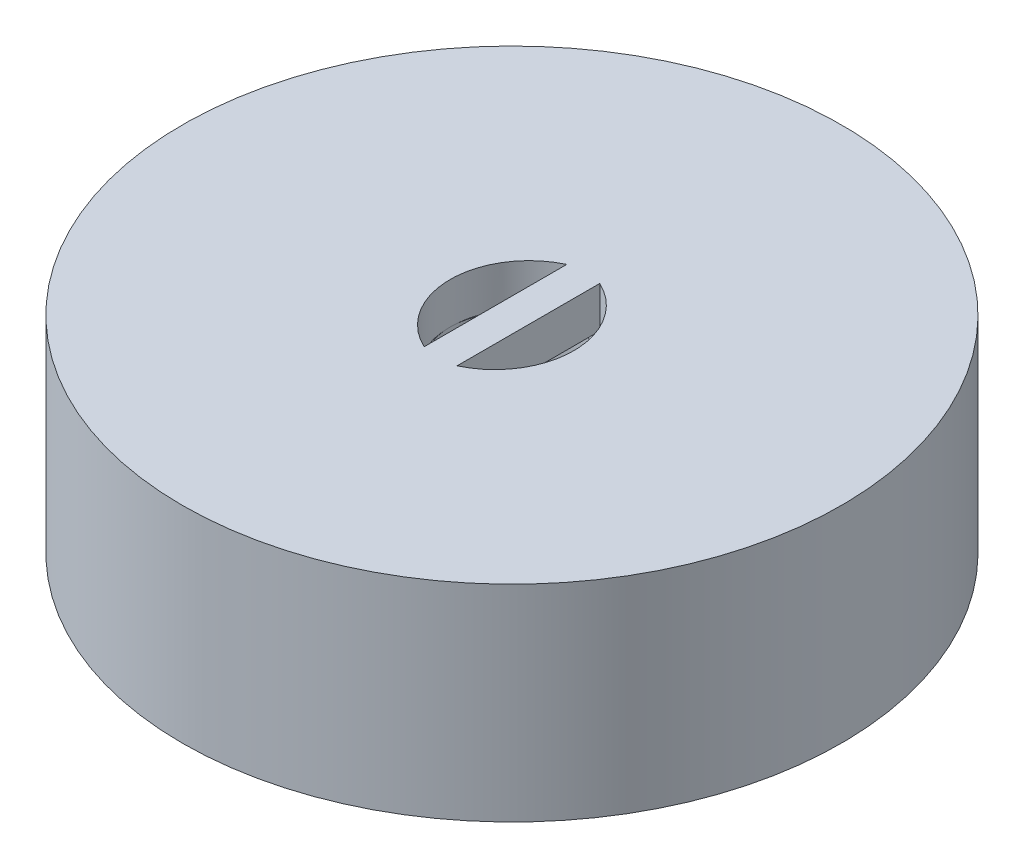
ISO-10303-21;
HEADER;
FILE_DESCRIPTION(('STEP AP214'),'2;1');
FILE_NAME('part.step','',(''),(''),'','','');
FILE_SCHEMA(('AUTOMOTIVE_DESIGN { 1 0 10303 214 1 1 1 1 }'));
ENDSEC;
DATA;
#1=APPLICATION_CONTEXT('core data for automotive mechanical design processes');
#2=APPLICATION_PROTOCOL_DEFINITION('international standard','automotive_design',2000,#1);
#3=PRODUCT_CONTEXT('',#1,'mechanical');
#4=PRODUCT('Part','Part','',(#3));
#5=PRODUCT_RELATED_PRODUCT_CATEGORY('part','',(#4));
#6=PRODUCT_DEFINITION_FORMATION('','',#4);
#7=PRODUCT_DEFINITION_CONTEXT('part definition',#1,'design');
#8=PRODUCT_DEFINITION('design','',#6,#7);
#9=PRODUCT_DEFINITION_SHAPE('','',#8);
#10=(LENGTH_UNIT() NAMED_UNIT(*) SI_UNIT(.MILLI.,.METRE.));
#11=(NAMED_UNIT(*) PLANE_ANGLE_UNIT() SI_UNIT($,.RADIAN.));
#12=(NAMED_UNIT(*) SI_UNIT($,.STERADIAN.) SOLID_ANGLE_UNIT());
#13=UNCERTAINTY_MEASURE_WITH_UNIT(LENGTH_MEASURE(1.E-05),#10,'distance_accuracy_value','');
#14=(GEOMETRIC_REPRESENTATION_CONTEXT(3) GLOBAL_UNCERTAINTY_ASSIGNED_CONTEXT((#13)) GLOBAL_UNIT_ASSIGNED_CONTEXT((#10,
#11,#12)) REPRESENTATION_CONTEXT('',''));
#15=CARTESIAN_POINT('',(0.,0.,0.));
#16=DIRECTION('',(0.,0.,1.));
#17=DIRECTION('',(1.,0.,0.));
#18=AXIS2_PLACEMENT_3D('',#15,#16,#17);
#19=CARTESIAN_POINT('',(-0.0516424017368183,0.5,0.));
#20=DIRECTION('',(0.,-1.,0.));
#21=DIRECTION('',(0.,0.,-1.));
#22=AXIS2_PLACEMENT_3D('',#19,#20,#21);
#23=PLANE('',#22);
#24=DIRECTION('',(0.,0.,1.));
#25=VECTOR('',#24,1.);
#26=CARTESIAN_POINT('',(0.05,0.5,-0.216466880786935));
#27=LINE('',#26,#25);
#28=CARTESIAN_POINT('',(0.05,0.5,-0.216466880786935));
#29=VERTEX_POINT('',#28);
#30=CARTESIAN_POINT('',(0.05,0.5,-0.180710403685012));
#31=VERTEX_POINT('',#30);
#32=EDGE_CURVE('E116',#29,#31,#27,.T.);
#33=ORIENTED_EDGE('',*,*,#32,.T.);
#34=CARTESIAN_POINT('',(0.,0.5,0.));
#35=DIRECTION('',(0.,-1.,0.));
#36=DIRECTION('',(0.,0.,-1.));
#37=AXIS2_PLACEMENT_3D('',#34,#35,#36);
#38=CIRCLE('',#37,0.1875);
#39=CARTESIAN_POINT('',(0.1875,0.5,0.));
#40=VERTEX_POINT('',#39);
#41=EDGE_CURVE('E102',#31,#40,#38,.T.);
#42=ORIENTED_EDGE('',*,*,#41,.T.);
#43=CARTESIAN_POINT('',(-0.0516424017368183,0.5,0.));
#44=DIRECTION('',(0.,1.,0.));
#45=DIRECTION('',(0.,0.,-1.));
#46=AXIS2_PLACEMENT_3D('',#43,#44,#45);
#47=CIRCLE('',#46,0.239142401736818);
#48=EDGE_CURVE('E121',#40,#29,#47,.T.);
#49=ORIENTED_EDGE('',*,*,#48,.T.);
#50=EDGE_LOOP('',(#33,#42,#49));
#51=FACE_BOUND('',#50,.T.);
#52=ADVANCED_FACE('F36',(#51),#23,.F.);
#53=CARTESIAN_POINT('',(0.0516424017368184,0.5,0.));
#54=DIRECTION('',(0.,1.,0.));
#55=DIRECTION('',(0.,0.,1.));
#56=AXIS2_PLACEMENT_3D('',#53,#54,#55);
#57=PLANE('',#56);
#58=DIRECTION('',(0.,0.,-1.));
#59=VECTOR('',#58,1.);
#60=CARTESIAN_POINT('',(-0.05,0.5,-0.216466880786935));
#61=LINE('',#60,#59);
#62=CARTESIAN_POINT('',(-0.05,0.5,0.216466880786935));
#63=VERTEX_POINT('',#62);
#64=CARTESIAN_POINT('',(-0.05,0.5,0.180710403685012));
#65=VERTEX_POINT('',#64);
#66=EDGE_CURVE('E317',#63,#65,#61,.T.);
#67=ORIENTED_EDGE('',*,*,#66,.T.);
#68=CARTESIAN_POINT('',(-0.1875,0.5,0.));
#69=VERTEX_POINT('',#68);
#70=EDGE_CURVE('E335',#65,#69,#38,.T.);
#71=ORIENTED_EDGE('',*,*,#70,.T.);
#72=CARTESIAN_POINT('',(0.0516424017368184,0.5,0.));
#73=DIRECTION('',(0.,1.,0.));
#74=DIRECTION('',(0.,0.,1.));
#75=AXIS2_PLACEMENT_3D('',#72,#73,#74);
#76=CIRCLE('',#75,0.239142401736818);
#77=EDGE_CURVE('E316',#69,#63,#76,.T.);
#78=ORIENTED_EDGE('',*,*,#77,.T.);
#79=EDGE_LOOP('',(#67,#71,#78));
#80=FACE_BOUND('',#79,.T.);
#81=ADVANCED_FACE('F156',(#80),#57,.T.);
#82=CARTESIAN_POINT('',(0.,0.625,0.));
#83=DIRECTION('',(0.,-1.,0.));
#84=DIRECTION('',(0.,0.,-1.));
#85=AXIS2_PLACEMENT_3D('',#82,#83,#84);
#86=CYLINDRICAL_SURFACE('',#85,1.);
#87=CARTESIAN_POINT('',(0.,0.625,0.));
#88=DIRECTION('',(0.,1.,0.));
#89=DIRECTION('',(0.,0.,1.));
#90=AXIS2_PLACEMENT_3D('',#87,#88,#89);
#91=CIRCLE('',#90,1.);
#92=CARTESIAN_POINT('',(0.,0.625,1.));
#93=VERTEX_POINT('',#92);
#94=EDGE_CURVE('E136',#93,#93,#91,.T.);
#95=ORIENTED_EDGE('',*,*,#94,.F.);
#96=EDGE_LOOP('',(#95));
#97=FACE_BOUND('',#96,.T.);
#98=CARTESIAN_POINT('',(0.,0.,0.));
#99=DIRECTION('',(0.,1.,0.));
#100=DIRECTION('',(0.,0.,1.));
#101=AXIS2_PLACEMENT_3D('',#98,#99,#100);
#102=CIRCLE('',#101,1.);
#103=CARTESIAN_POINT('',(0.,0.,1.));
#104=VERTEX_POINT('',#103);
#105=EDGE_CURVE('E139',#104,#104,#102,.T.);
#106=ORIENTED_EDGE('',*,*,#105,.T.);
#107=EDGE_LOOP('',(#106));
#108=FACE_BOUND('',#107,.T.);
#109=ADVANCED_FACE('F162',(#97,#108),#86,.T.);
#110=CARTESIAN_POINT('',(0.,0.625,0.));
#111=DIRECTION('',(0.,1.,0.));
#112=DIRECTION('',(0.,0.,1.));
#113=AXIS2_PLACEMENT_3D('',#110,#111,#112);
#114=PLANE('',#113);
#115=CARTESIAN_POINT('',(0.0516424017368184,0.625,0.));
#116=DIRECTION('',(0.,1.,0.));
#117=DIRECTION('',(0.,0.,1.));
#118=AXIS2_PLACEMENT_3D('',#115,#116,#117);
#119=CIRCLE('',#118,0.239142401736818);
#120=CARTESIAN_POINT('',(-0.05,0.625,-0.216466880786935));
#121=VERTEX_POINT('',#120);
#122=CARTESIAN_POINT('',(-0.05,0.625,0.216466880786935));
#123=VERTEX_POINT('',#122);
#124=EDGE_CURVE('E134',#121,#123,#119,.T.);
#125=ORIENTED_EDGE('',*,*,#124,.F.);
#126=DIRECTION('',(0.,0.,-1.));
#127=VECTOR('',#126,1.);
#128=CARTESIAN_POINT('',(-0.05,0.625,-0.216466880786935));
#129=LINE('',#128,#127);
#130=EDGE_CURVE('E322',#123,#121,#129,.T.);
#131=ORIENTED_EDGE('',*,*,#130,.F.);
#132=EDGE_LOOP('',(#125,#131));
#133=FACE_BOUND('',#132,.T.);
#134=CARTESIAN_POINT('',(-0.0516424017368183,0.625,0.));
#135=DIRECTION('',(0.,1.,0.));
#136=DIRECTION('',(0.,0.,-1.));
#137=AXIS2_PLACEMENT_3D('',#134,#135,#136);
#138=CIRCLE('',#137,0.239142401736818);
#139=CARTESIAN_POINT('',(0.05,0.625,0.216466880786935));
#140=VERTEX_POINT('',#139);
#141=CARTESIAN_POINT('',(0.05,0.625,-0.216466880786935));
#142=VERTEX_POINT('',#141);
#143=EDGE_CURVE('E130',#140,#142,#138,.T.);
#144=ORIENTED_EDGE('',*,*,#143,.F.);
#145=DIRECTION('',(0.,0.,1.));
#146=VECTOR('',#145,1.);
#147=CARTESIAN_POINT('',(0.05,0.625,-0.216466880786935));
#148=LINE('',#147,#146);
#149=EDGE_CURVE('E132',#142,#140,#148,.T.);
#150=ORIENTED_EDGE('',*,*,#149,.F.);
#151=EDGE_LOOP('',(#144,#150));
#152=FACE_BOUND('',#151,.T.);
#153=ORIENTED_EDGE('',*,*,#94,.T.);
#154=EDGE_LOOP('',(#153));
#155=FACE_BOUND('',#154,.T.);
#156=ADVANCED_FACE('F184',(#133,#152,#155),#114,.T.);
#157=CARTESIAN_POINT('',(0.,0.,0.));
#158=DIRECTION('',(0.,1.,0.));
#159=DIRECTION('',(0.,0.,1.));
#160=AXIS2_PLACEMENT_3D('',#157,#158,#159);
#161=PLANE('',#160);
#162=CARTESIAN_POINT('',(0.,0.,0.));
#163=DIRECTION('',(0.,1.,0.));
#164=DIRECTION('',(0.,0.,1.));
#165=AXIS2_PLACEMENT_3D('',#162,#163,#164);
#166=CIRCLE('',#165,0.475);
#167=CARTESIAN_POINT('',(0.,0.,0.475));
#168=VERTEX_POINT('',#167);
#169=EDGE_CURVE('E11',#168,#168,#166,.T.);
#170=ORIENTED_EDGE('',*,*,#169,.T.);
#171=EDGE_LOOP('',(#170));
#172=FACE_BOUND('',#171,.T.);
#173=ORIENTED_EDGE('',*,*,#105,.F.);
#174=EDGE_LOOP('',(#173));
#175=FACE_BOUND('',#174,.T.);
#176=ADVANCED_FACE('F187',(#172,#175),#161,.F.);
#177=CARTESIAN_POINT('',(-0.0516424017368183,0.5,0.));
#178=DIRECTION('',(0.,1.,0.));
#179=DIRECTION('',(0.,0.,1.));
#180=AXIS2_PLACEMENT_3D('',#177,#178,#179);
#181=CYLINDRICAL_SURFACE('',#180,0.239142401736818);
#182=ORIENTED_EDGE('',*,*,#143,.T.);
#183=DIRECTION('',(0.,1.,0.));
#184=VECTOR('',#183,1.);
#185=CARTESIAN_POINT('',(0.05,0.5,-0.216466880786935));
#186=LINE('',#185,#184);
#187=EDGE_CURVE('E123',#29,#142,#186,.T.);
#188=ORIENTED_EDGE('',*,*,#187,.F.);
#189=ORIENTED_EDGE('',*,*,#48,.F.);
#190=CARTESIAN_POINT('',(0.05,0.5,0.216466880786935));
#191=VERTEX_POINT('',#190);
#192=EDGE_CURVE('E126',#191,#40,#47,.T.);
#193=ORIENTED_EDGE('',*,*,#192,.F.);
#194=DIRECTION('',(0.,1.,0.));
#195=VECTOR('',#194,1.);
#196=CARTESIAN_POINT('',(0.05,0.5,0.216466880786935));
#197=LINE('',#196,#195);
#198=EDGE_CURVE('E124',#191,#140,#197,.T.);
#199=ORIENTED_EDGE('',*,*,#198,.T.);
#200=EDGE_LOOP('',(#182,#188,#189,#193,#199));
#201=FACE_BOUND('',#200,.T.);
#202=ADVANCED_FACE('F177',(#201),#181,.F.);
#203=CARTESIAN_POINT('',(0.05,0.5,-0.216466880786935));
#204=DIRECTION('',(-1.,0.,0.));
#205=DIRECTION('',(0.,0.,1.));
#206=AXIS2_PLACEMENT_3D('',#203,#204,#205);
#207=PLANE('',#206);
#208=ORIENTED_EDGE('',*,*,#149,.T.);
#209=ORIENTED_EDGE('',*,*,#198,.F.);
#210=CARTESIAN_POINT('',(0.05,0.5,0.180710403685012));
#211=VERTEX_POINT('',#210);
#212=EDGE_CURVE('E118',#211,#191,#27,.T.);
#213=ORIENTED_EDGE('',*,*,#212,.F.);
#214=EDGE_CURVE('E94',#31,#211,#27,.T.);
#215=ORIENTED_EDGE('',*,*,#214,.F.);
#216=ORIENTED_EDGE('',*,*,#32,.F.);
#217=ORIENTED_EDGE('',*,*,#187,.T.);
#218=EDGE_LOOP('',(#208,#209,#213,#215,#216,#217));
#219=FACE_BOUND('',#218,.T.);
#220=ADVANCED_FACE('F114',(#219),#207,.F.);
#221=ORIENTED_EDGE('',*,*,#192,.T.);
#222=EDGE_CURVE('E106',#40,#211,#38,.T.);
#223=ORIENTED_EDGE('',*,*,#222,.T.);
#224=ORIENTED_EDGE('',*,*,#212,.T.);
#225=EDGE_LOOP('',(#221,#223,#224));
#226=FACE_BOUND('',#225,.T.);
#227=ADVANCED_FACE('F158',(#226),#23,.F.);
#228=CARTESIAN_POINT('',(0.0516424017368184,0.5,0.));
#229=DIRECTION('',(0.,1.,0.));
#230=DIRECTION('',(0.,0.,1.));
#231=AXIS2_PLACEMENT_3D('',#228,#229,#230);
#232=CYLINDRICAL_SURFACE('',#231,0.239142401736818);
#233=ORIENTED_EDGE('',*,*,#124,.T.);
#234=DIRECTION('',(0.,1.,0.));
#235=VECTOR('',#234,1.);
#236=CARTESIAN_POINT('',(-0.05,0.5,0.216466880786935));
#237=LINE('',#236,#235);
#238=EDGE_CURVE('E320',#63,#123,#237,.T.);
#239=ORIENTED_EDGE('',*,*,#238,.F.);
#240=ORIENTED_EDGE('',*,*,#77,.F.);
#241=CARTESIAN_POINT('',(-0.05,0.5,-0.216466880786935));
#242=VERTEX_POINT('',#241);
#243=EDGE_CURVE('E312',#242,#69,#76,.T.);
#244=ORIENTED_EDGE('',*,*,#243,.F.);
#245=DIRECTION('',(0.,1.,0.));
#246=VECTOR('',#245,1.);
#247=CARTESIAN_POINT('',(-0.05,0.5,-0.216466880786935));
#248=LINE('',#247,#246);
#249=EDGE_CURVE('E141',#242,#121,#248,.T.);
#250=ORIENTED_EDGE('',*,*,#249,.T.);
#251=EDGE_LOOP('',(#233,#239,#240,#244,#250));
#252=FACE_BOUND('',#251,.T.);
#253=ADVANCED_FACE('F169',(#252),#232,.F.);
#254=CARTESIAN_POINT('',(-0.05,0.5,-0.216466880786935));
#255=DIRECTION('',(1.,0.,0.));
#256=DIRECTION('',(0.,0.,-1.));
#257=AXIS2_PLACEMENT_3D('',#254,#255,#256);
#258=PLANE('',#257);
#259=ORIENTED_EDGE('',*,*,#130,.T.);
#260=ORIENTED_EDGE('',*,*,#249,.F.);
#261=CARTESIAN_POINT('',(-0.05,0.5,-0.180710403685012));
#262=VERTEX_POINT('',#261);
#263=EDGE_CURVE('E315',#262,#242,#61,.T.);
#264=ORIENTED_EDGE('',*,*,#263,.F.);
#265=EDGE_CURVE('E97',#65,#262,#61,.T.);
#266=ORIENTED_EDGE('',*,*,#265,.F.);
#267=ORIENTED_EDGE('',*,*,#66,.F.);
#268=ORIENTED_EDGE('',*,*,#238,.T.);
#269=EDGE_LOOP('',(#259,#260,#264,#266,#267,#268));
#270=FACE_BOUND('',#269,.T.);
#271=ADVANCED_FACE('F175',(#270),#258,.F.);
#272=ORIENTED_EDGE('',*,*,#243,.T.);
#273=EDGE_CURVE('E99',#69,#262,#38,.T.);
#274=ORIENTED_EDGE('',*,*,#273,.T.);
#275=ORIENTED_EDGE('',*,*,#263,.T.);
#276=EDGE_LOOP('',(#272,#274,#275));
#277=FACE_BOUND('',#276,.T.);
#278=ADVANCED_FACE('F165',(#277),#57,.T.);
#279=CARTESIAN_POINT('',(0.,-0.375,0.));
#280=DIRECTION('',(0.,1.,0.));
#281=DIRECTION('',(0.,0.,1.));
#282=AXIS2_PLACEMENT_3D('',#279,#280,#281);
#283=CYLINDRICAL_SURFACE('',#282,0.375);
#284=CARTESIAN_POINT('',(0.,-0.1,0.));
#285=DIRECTION('',(0.,1.,0.));
#286=DIRECTION('',(0.,0.,1.));
#287=AXIS2_PLACEMENT_3D('',#284,#285,#286);
#288=CIRCLE('',#287,0.375);
#289=CARTESIAN_POINT('',(0.,-0.1,0.375));
#290=VERTEX_POINT('',#289);
#291=EDGE_CURVE('E44',#290,#290,#288,.F.);
#292=ORIENTED_EDGE('',*,*,#291,.T.);
#293=EDGE_LOOP('',(#292));
#294=FACE_BOUND('',#293,.T.);
#295=CARTESIAN_POINT('',(0.,-0.375,0.));
#296=DIRECTION('',(0.,-1.,0.));
#297=DIRECTION('',(0.,0.,-1.));
#298=AXIS2_PLACEMENT_3D('',#295,#296,#297);
#299=CIRCLE('',#298,0.375);
#300=CARTESIAN_POINT('',(0.,-0.375,-0.375));
#301=VERTEX_POINT('',#300);
#302=EDGE_CURVE('E119',#301,#301,#299,.T.);
#303=ORIENTED_EDGE('',*,*,#302,.F.);
#304=EDGE_LOOP('',(#303));
#305=FACE_BOUND('',#304,.T.);
#306=ADVANCED_FACE('F145',(#294,#305),#283,.T.);
#307=CARTESIAN_POINT('',(0.,-0.375,0.));
#308=DIRECTION('',(0.,-1.,0.));
#309=DIRECTION('',(0.,0.,-1.));
#310=AXIS2_PLACEMENT_3D('',#307,#308,#309);
#311=PLANE('',#310);
#312=CARTESIAN_POINT('',(0.,-0.375,0.));
#313=DIRECTION('',(0.,-1.,0.));
#314=DIRECTION('',(0.,0.,-1.));
#315=AXIS2_PLACEMENT_3D('',#312,#313,#314);
#316=CIRCLE('',#315,0.1875);
#317=CARTESIAN_POINT('',(0.,-0.375,-0.1875));
#318=VERTEX_POINT('',#317);
#319=EDGE_CURVE('E100',#318,#318,#316,.T.);
#320=ORIENTED_EDGE('',*,*,#319,.F.);
#321=EDGE_LOOP('',(#320));
#322=FACE_BOUND('',#321,.T.);
#323=ORIENTED_EDGE('',*,*,#302,.T.);
#324=EDGE_LOOP('',(#323));
#325=FACE_BOUND('',#324,.T.);
#326=ADVANCED_FACE('F244',(#322,#325),#311,.T.);
#327=CARTESIAN_POINT('',(0.,0.5,0.));
#328=DIRECTION('',(0.,-1.,0.));
#329=DIRECTION('',(0.,0.,-1.));
#330=AXIS2_PLACEMENT_3D('',#327,#328,#329);
#331=PLANE('',#330);
#332=ORIENTED_EDGE('',*,*,#214,.T.);
#333=EDGE_CURVE('E51',#211,#65,#38,.T.);
#334=ORIENTED_EDGE('',*,*,#333,.T.);
#335=ORIENTED_EDGE('',*,*,#265,.T.);
#336=EDGE_CURVE('E58',#262,#31,#38,.T.);
#337=ORIENTED_EDGE('',*,*,#336,.T.);
#338=EDGE_LOOP('',(#332,#334,#335,#337));
#339=FACE_BOUND('',#338,.T.);
#340=ADVANCED_FACE('F92',(#339),#331,.T.);
#341=CARTESIAN_POINT('',(0.,0.5,0.));
#342=DIRECTION('',(0.,-1.,0.));
#343=DIRECTION('',(0.,0.,-1.));
#344=AXIS2_PLACEMENT_3D('',#341,#342,#343);
#345=CYLINDRICAL_SURFACE('',#344,0.1875);
#346=ORIENTED_EDGE('',*,*,#41,.F.);
#347=ORIENTED_EDGE('',*,*,#336,.F.);
#348=ORIENTED_EDGE('',*,*,#273,.F.);
#349=ORIENTED_EDGE('',*,*,#70,.F.);
#350=ORIENTED_EDGE('',*,*,#333,.F.);
#351=ORIENTED_EDGE('',*,*,#222,.F.);
#352=EDGE_LOOP('',(#346,#347,#348,#349,#350,#351));
#353=FACE_BOUND('',#352,.T.);
#354=ORIENTED_EDGE('',*,*,#319,.T.);
#355=EDGE_LOOP('',(#354));
#356=FACE_BOUND('',#355,.T.);
#357=ADVANCED_FACE('F104',(#353,#356),#345,.F.);
#358=CARTESIAN_POINT('',(0.,-0.1,0.));
#359=DIRECTION('',(0.,1.,0.));
#360=DIRECTION('',(0.,0.,1.));
#361=AXIS2_PLACEMENT_3D('',#358,#359,#360);
#362=TOROIDAL_SURFACE('',#361,0.475,0.1);
#363=ORIENTED_EDGE('',*,*,#169,.F.);
#364=EDGE_LOOP('',(#363));
#365=FACE_BOUND('',#364,.T.);
#366=ORIENTED_EDGE('',*,*,#291,.F.);
#367=EDGE_LOOP('',(#366));
#368=FACE_BOUND('',#367,.T.);
#369=ADVANCED_FACE('F38',(#365,#368),#362,.F.);
#370=CLOSED_SHELL('',(#52,#81,#109,#156,#176,#202,#220,#227,#253,#271,#278,#306,#326,#340,#357,#369));
#371=MANIFOLD_SOLID_BREP('B2',#370);
#372=ADVANCED_BREP_SHAPE_REPRESENTATION('',(#18,#371),#14);
#373=SHAPE_DEFINITION_REPRESENTATION(#9,#372);
ENDSEC;
END-ISO-10303-21;
